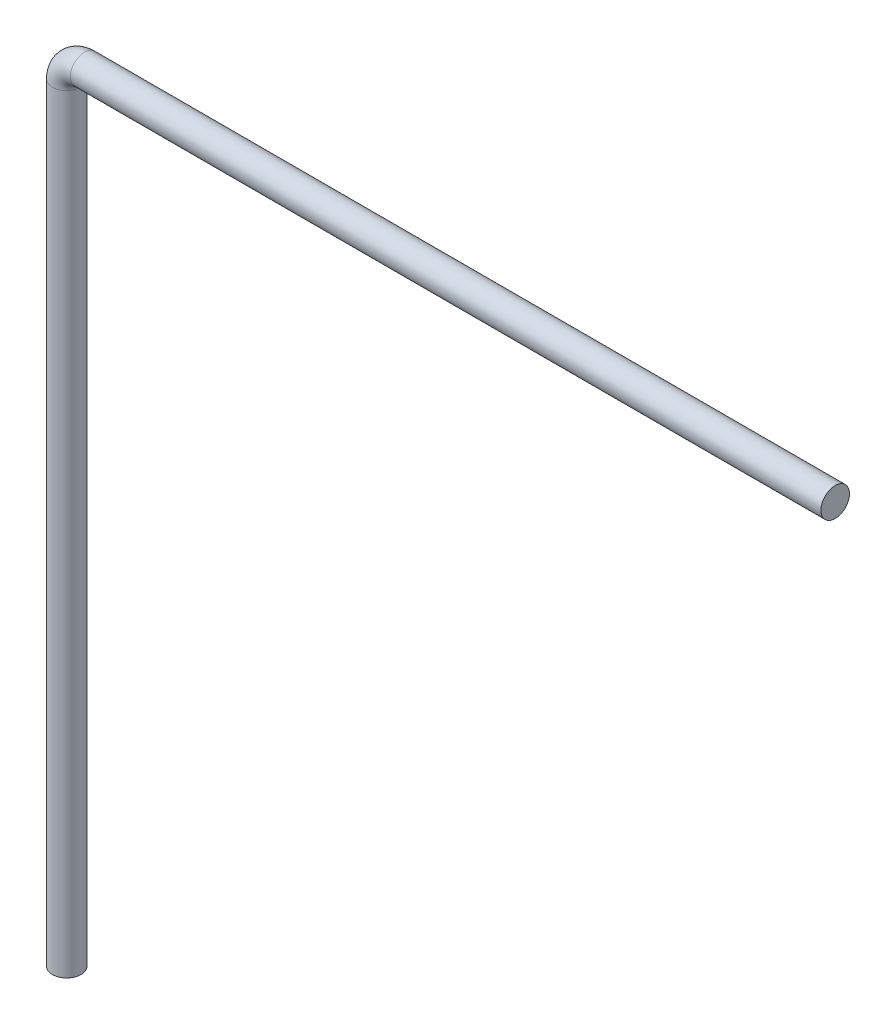
ISO-10303-21;
HEADER;
FILE_DESCRIPTION(('STEP AP214'),'2;1');
FILE_NAME('part.step','',(''),(''),'','','');
FILE_SCHEMA(('AUTOMOTIVE_DESIGN { 1 0 10303 214 1 1 1 1 }'));
ENDSEC;
DATA;
#1=APPLICATION_CONTEXT('core data for automotive mechanical design processes');
#2=APPLICATION_PROTOCOL_DEFINITION('international standard','automotive_design',2000,#1);
#3=PRODUCT_CONTEXT('',#1,'mechanical');
#4=PRODUCT('Part','Part','',(#3));
#5=PRODUCT_RELATED_PRODUCT_CATEGORY('part','',(#4));
#6=PRODUCT_DEFINITION_FORMATION('','',#4);
#7=PRODUCT_DEFINITION_CONTEXT('part definition',#1,'design');
#8=PRODUCT_DEFINITION('design','',#6,#7);
#9=PRODUCT_DEFINITION_SHAPE('','',#8);
#10=(LENGTH_UNIT() NAMED_UNIT(*) SI_UNIT(.MILLI.,.METRE.));
#11=(NAMED_UNIT(*) PLANE_ANGLE_UNIT() SI_UNIT($,.RADIAN.));
#12=(NAMED_UNIT(*) SI_UNIT($,.STERADIAN.) SOLID_ANGLE_UNIT());
#13=UNCERTAINTY_MEASURE_WITH_UNIT(LENGTH_MEASURE(1.E-05),#10,'distance_accuracy_value','');
#14=(GEOMETRIC_REPRESENTATION_CONTEXT(3) GLOBAL_UNCERTAINTY_ASSIGNED_CONTEXT((#13)) GLOBAL_UNIT_ASSIGNED_CONTEXT((#10,
#11,#12)) REPRESENTATION_CONTEXT('',''));
#15=CARTESIAN_POINT('',(0.,0.,0.));
#16=DIRECTION('',(0.,0.,1.));
#17=DIRECTION('',(1.,0.,0.));
#18=AXIS2_PLACEMENT_3D('',#15,#16,#17);
#19=CARTESIAN_POINT('',(0.,0.,0.));
#20=DIRECTION('',(0.,1.,0.));
#21=DIRECTION('',(0.,0.,1.));
#22=AXIS2_PLACEMENT_3D('',#19,#20,#21);
#23=PLANE('',#22);
#24=CARTESIAN_POINT('',(0.,0.,0.));
#25=DIRECTION('',(0.,1.,0.));
#26=DIRECTION('',(0.,0.,1.));
#27=AXIS2_PLACEMENT_3D('',#24,#25,#26);
#28=CIRCLE('',#27,0.4);
#29=CARTESIAN_POINT('',(0.,0.,0.4));
#30=VERTEX_POINT('',#29);
#31=EDGE_CURVE('E47',#30,#30,#28,.T.);
#32=ORIENTED_EDGE('',*,*,#31,.F.);
#33=EDGE_LOOP('',(#32));
#34=FACE_BOUND('',#33,.T.);
#35=ADVANCED_FACE('F35',(#34),#23,.F.);
#36=CARTESIAN_POINT('',(21.5,22.,0.));
#37=DIRECTION('',(1.,0.,0.));
#38=DIRECTION('',(0.,0.,1.));
#39=AXIS2_PLACEMENT_3D('',#36,#37,#38);
#40=PLANE('',#39);
#41=CARTESIAN_POINT('',(21.5,22.,0.));
#42=DIRECTION('',(1.,0.,0.));
#43=DIRECTION('',(0.,0.,1.));
#44=AXIS2_PLACEMENT_3D('',#41,#42,#43);
#45=CIRCLE('',#44,0.4);
#46=CARTESIAN_POINT('',(21.5,22.,0.4));
#47=VERTEX_POINT('',#46);
#48=EDGE_CURVE('E11',#47,#47,#45,.T.);
#49=ORIENTED_EDGE('',*,*,#48,.T.);
#50=EDGE_LOOP('',(#49));
#51=FACE_BOUND('',#50,.T.);
#52=ADVANCED_FACE('F50',(#51),#40,.T.);
#53=CARTESIAN_POINT('',(0.,0.,0.));
#54=DIRECTION('',(0.,1.,0.));
#55=DIRECTION('',(0.,0.,1.));
#56=AXIS2_PLACEMENT_3D('',#53,#54,#55);
#57=CYLINDRICAL_SURFACE('',#56,0.4);
#58=CARTESIAN_POINT('',(0.,21.5,0.));
#59=DIRECTION('',(0.,1.,0.));
#60=DIRECTION('',(0.,0.,1.));
#61=AXIS2_PLACEMENT_3D('',#58,#59,#60);
#62=CIRCLE('',#61,0.4);
#63=CARTESIAN_POINT('',(-0.4,21.5,0.));
#64=VERTEX_POINT('',#63);
#65=EDGE_CURVE('E60',#64,#64,#62,.T.);
#66=ORIENTED_EDGE('',*,*,#65,.F.);
#67=EDGE_LOOP('',(#66));
#68=FACE_BOUND('',#67,.T.);
#69=ORIENTED_EDGE('',*,*,#31,.T.);
#70=EDGE_LOOP('',(#69));
#71=FACE_BOUND('',#70,.T.);
#72=ADVANCED_FACE('F65',(#68,#71),#57,.T.);
#73=CARTESIAN_POINT('',(0.5,21.5,0.));
#74=DIRECTION('',(0.,0.,-1.));
#75=DIRECTION('',(-1.,0.,0.));
#76=AXIS2_PLACEMENT_3D('',#73,#74,#75);
#77=TOROIDAL_SURFACE('',#76,0.5,0.4);
#78=CARTESIAN_POINT('',(0.5,22.,0.));
#79=DIRECTION('',(1.,0.,0.));
#80=DIRECTION('',(0.,0.,1.));
#81=AXIS2_PLACEMENT_3D('',#78,#79,#80);
#82=CIRCLE('',#81,0.4);
#83=CARTESIAN_POINT('',(0.5,22.4,0.));
#84=VERTEX_POINT('',#83);
#85=EDGE_CURVE('E42',#84,#84,#82,.T.);
#86=CARTESIAN_POINT('',(0.5,21.5,0.));
#87=DIRECTION('',(0.,0.,-1.));
#88=DIRECTION('',(-1.,0.,0.));
#89=AXIS2_PLACEMENT_3D('',#86,#87,#88);
#90=CIRCLE('',#89,0.9);
#91=EDGE_CURVE('',#64,#84,#90,.T.);
#92=ORIENTED_EDGE('',*,*,#65,.T.);
#93=ORIENTED_EDGE('',*,*,#85,.F.);
#94=ORIENTED_EDGE('',*,*,#91,.T.);
#95=ORIENTED_EDGE('',*,*,#91,.F.);
#96=EDGE_LOOP('',(#92,#94,#93,#95));
#97=FACE_BOUND('',#96,.T.);
#98=ADVANCED_FACE('F55',(#97),#77,.T.);
#99=CARTESIAN_POINT('',(0.5,22.,0.));
#100=DIRECTION('',(1.,0.,0.));
#101=DIRECTION('',(0.,0.,-1.));
#102=AXIS2_PLACEMENT_3D('',#99,#100,#101);
#103=CYLINDRICAL_SURFACE('',#102,0.4);
#104=ORIENTED_EDGE('',*,*,#48,.F.);
#105=EDGE_LOOP('',(#104));
#106=FACE_BOUND('',#105,.T.);
#107=ORIENTED_EDGE('',*,*,#85,.T.);
#108=EDGE_LOOP('',(#107));
#109=FACE_BOUND('',#108,.T.);
#110=ADVANCED_FACE('F52',(#106,#109),#103,.T.);
#111=CLOSED_SHELL('',(#35,#52,#72,#98,#110));
#112=MANIFOLD_SOLID_BREP('B2',#111);
#113=ADVANCED_BREP_SHAPE_REPRESENTATION('',(#18,#112),#14);
#114=SHAPE_DEFINITION_REPRESENTATION(#9,#113);
ENDSEC;
END-ISO-10303-21;
